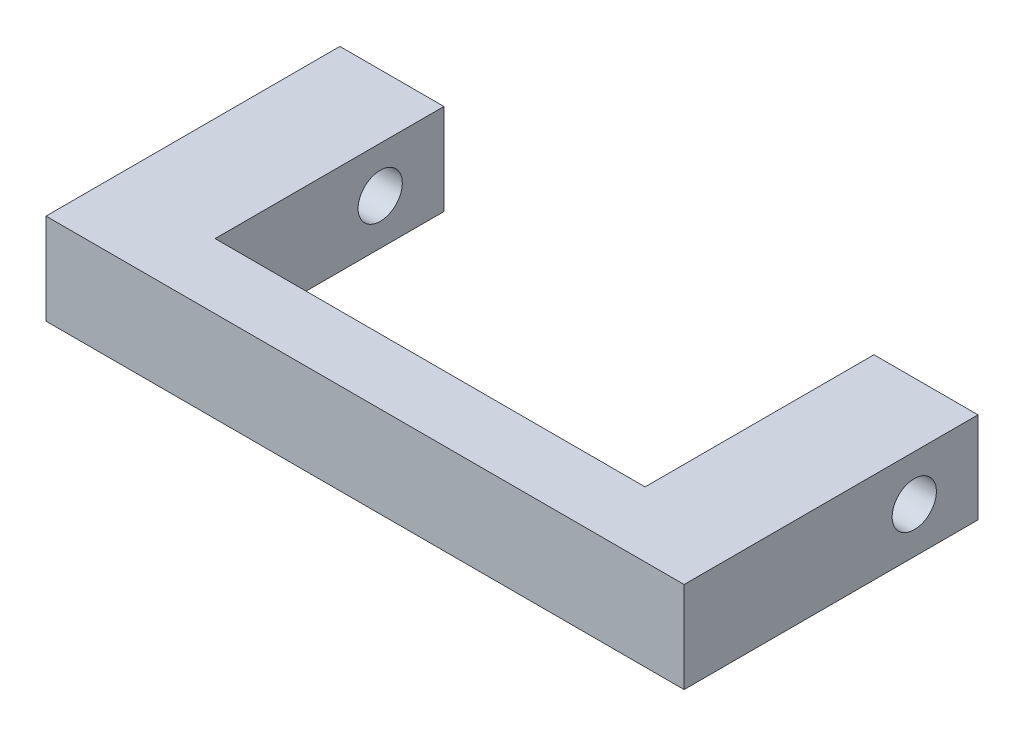
ISO-10303-21;
HEADER;
FILE_DESCRIPTION(('STEP AP214'),'2;1');
FILE_NAME('part.step','',(''),(''),'','','');
FILE_SCHEMA(('AUTOMOTIVE_DESIGN { 1 0 10303 214 1 1 1 1 }'));
ENDSEC;
DATA;
#1=APPLICATION_CONTEXT('core data for automotive mechanical design processes');
#2=APPLICATION_PROTOCOL_DEFINITION('international standard','automotive_design',2000,#1);
#3=PRODUCT_CONTEXT('',#1,'mechanical');
#4=PRODUCT('Part','Part','',(#3));
#5=PRODUCT_RELATED_PRODUCT_CATEGORY('part','',(#4));
#6=PRODUCT_DEFINITION_FORMATION('','',#4);
#7=PRODUCT_DEFINITION_CONTEXT('part definition',#1,'design');
#8=PRODUCT_DEFINITION('design','',#6,#7);
#9=PRODUCT_DEFINITION_SHAPE('','',#8);
#10=(LENGTH_UNIT() NAMED_UNIT(*) SI_UNIT(.MILLI.,.METRE.));
#11=(NAMED_UNIT(*) PLANE_ANGLE_UNIT() SI_UNIT($,.RADIAN.));
#12=(NAMED_UNIT(*) SI_UNIT($,.STERADIAN.) SOLID_ANGLE_UNIT());
#13=UNCERTAINTY_MEASURE_WITH_UNIT(LENGTH_MEASURE(1.E-05),#10,'distance_accuracy_value','');
#14=(GEOMETRIC_REPRESENTATION_CONTEXT(3) GLOBAL_UNCERTAINTY_ASSIGNED_CONTEXT((#13)) GLOBAL_UNIT_ASSIGNED_CONTEXT((#10,
#11,#12)) REPRESENTATION_CONTEXT('',''));
#15=CARTESIAN_POINT('',(0.,0.,0.));
#16=DIRECTION('',(0.,0.,1.));
#17=DIRECTION('',(1.,0.,0.));
#18=AXIS2_PLACEMENT_3D('',#15,#16,#17);
#19=CARTESIAN_POINT('',(-87.25,7.,27.0051780117579));
#20=DIRECTION('',(0.,0.,1.));
#21=DIRECTION('',(1.,0.,0.));
#22=AXIS2_PLACEMENT_3D('',#19,#20,#21);
#23=PLANE('',#22);
#24=DIRECTION('',(-1.,0.,0.));
#25=VECTOR('',#24,1.);
#26=CARTESIAN_POINT('',(-87.25,0.,27.0051780117579));
#27=LINE('',#26,#25);
#28=CARTESIAN_POINT('',(-87.25,0.,27.0051780117579));
#29=VERTEX_POINT('',#28);
#30=CARTESIAN_POINT('',(-95.25,0.,27.0051780117579));
#31=VERTEX_POINT('',#30);
#32=EDGE_CURVE('E141',#29,#31,#27,.T.);
#33=ORIENTED_EDGE('',*,*,#32,.T.);
#34=DIRECTION('',(0.,-1.,0.));
#35=VECTOR('',#34,1.);
#36=CARTESIAN_POINT('',(-95.25,7.,27.0051780117579));
#37=LINE('',#36,#35);
#38=CARTESIAN_POINT('',(-95.25,7.,27.0051780117579));
#39=VERTEX_POINT('',#38);
#40=EDGE_CURVE('E11',#39,#31,#37,.T.);
#41=ORIENTED_EDGE('',*,*,#40,.F.);
#42=DIRECTION('',(-1.,0.,0.));
#43=VECTOR('',#42,1.);
#44=CARTESIAN_POINT('',(-87.25,7.,27.0051780117579));
#45=LINE('',#44,#43);
#46=CARTESIAN_POINT('',(-87.25,7.,27.0051780117579));
#47=VERTEX_POINT('',#46);
#48=EDGE_CURVE('E165',#47,#39,#45,.T.);
#49=ORIENTED_EDGE('',*,*,#48,.F.);
#50=DIRECTION('',(0.,-1.,0.));
#51=VECTOR('',#50,1.);
#52=CARTESIAN_POINT('',(-87.25,7.,27.0051780117579));
#53=LINE('',#52,#51);
#54=EDGE_CURVE('E137',#47,#29,#53,.T.);
#55=ORIENTED_EDGE('',*,*,#54,.T.);
#56=EDGE_LOOP('',(#33,#41,#49,#55));
#57=FACE_BOUND('',#56,.T.);
#58=ADVANCED_FACE('F39',(#57),#23,.F.);
#59=CARTESIAN_POINT('',(-95.25,7.,27.0051780117579));
#60=DIRECTION('',(1.,0.,0.));
#61=DIRECTION('',(0.,0.,-1.));
#62=AXIS2_PLACEMENT_3D('',#59,#60,#61);
#63=PLANE('',#62);
#64=CARTESIAN_POINT('',(-95.25,3.5,31.9051780117579));
#65=DIRECTION('',(1.,0.,0.));
#66=DIRECTION('',(0.,0.,-1.));
#67=AXIS2_PLACEMENT_3D('',#64,#65,#66);
#68=CIRCLE('',#67,1.7);
#69=CARTESIAN_POINT('',(-95.25,3.5,30.2051780117579));
#70=VERTEX_POINT('',#69);
#71=EDGE_CURVE('E146',#70,#70,#68,.T.);
#72=ORIENTED_EDGE('',*,*,#71,.T.);
#73=EDGE_LOOP('',(#72));
#74=FACE_BOUND('',#73,.T.);
#75=DIRECTION('',(0.,0.,1.));
#76=VECTOR('',#75,1.);
#77=CARTESIAN_POINT('',(-95.25,0.,27.0051780117579));
#78=LINE('',#77,#76);
#79=CARTESIAN_POINT('',(-95.25,0.,49.6051780117579));
#80=VERTEX_POINT('',#79);
#81=EDGE_CURVE('E145',#31,#80,#78,.T.);
#82=ORIENTED_EDGE('',*,*,#81,.T.);
#83=DIRECTION('',(0.,-1.,0.));
#84=VECTOR('',#83,1.);
#85=CARTESIAN_POINT('',(-95.25,7.,49.6051780117579));
#86=LINE('',#85,#84);
#87=CARTESIAN_POINT('',(-95.25,7.,49.6051780117579));
#88=VERTEX_POINT('',#87);
#89=EDGE_CURVE('E49',#88,#80,#86,.T.);
#90=ORIENTED_EDGE('',*,*,#89,.F.);
#91=DIRECTION('',(0.,0.,1.));
#92=VECTOR('',#91,1.);
#93=CARTESIAN_POINT('',(-95.25,7.,27.0051780117579));
#94=LINE('',#93,#92);
#95=EDGE_CURVE('E100',#39,#88,#94,.T.);
#96=ORIENTED_EDGE('',*,*,#95,.F.);
#97=ORIENTED_EDGE('',*,*,#40,.T.);
#98=EDGE_LOOP('',(#82,#90,#96,#97));
#99=FACE_BOUND('',#98,.T.);
#100=ADVANCED_FACE('F187',(#74,#99),#63,.F.);
#101=CARTESIAN_POINT('',(-46.181,7.,49.6051780117579));
#102=DIRECTION('',(0.,0.,-1.));
#103=DIRECTION('',(-1.,0.,0.));
#104=AXIS2_PLACEMENT_3D('',#101,#102,#103);
#105=PLANE('',#104);
#106=DIRECTION('',(1.,0.,0.));
#107=VECTOR('',#106,1.);
#108=CARTESIAN_POINT('',(-46.181,0.,49.6051780117579));
#109=LINE('',#108,#107);
#110=CARTESIAN_POINT('',(-46.181,0.,49.6051780117579));
#111=VERTEX_POINT('',#110);
#112=EDGE_CURVE('E150',#80,#111,#109,.T.);
#113=ORIENTED_EDGE('',*,*,#112,.T.);
#114=DIRECTION('',(0.,-1.,0.));
#115=VECTOR('',#114,1.);
#116=CARTESIAN_POINT('',(-46.181,7.,49.6051780117579));
#117=LINE('',#116,#115);
#118=CARTESIAN_POINT('',(-46.181,7.,49.6051780117579));
#119=VERTEX_POINT('',#118);
#120=EDGE_CURVE('E176',#119,#111,#117,.T.);
#121=ORIENTED_EDGE('',*,*,#120,.F.);
#122=DIRECTION('',(1.,0.,0.));
#123=VECTOR('',#122,1.);
#124=CARTESIAN_POINT('',(-95.25,7.,49.6051780117579));
#125=LINE('',#124,#123);
#126=EDGE_CURVE('E186',#88,#119,#125,.T.);
#127=ORIENTED_EDGE('',*,*,#126,.F.);
#128=ORIENTED_EDGE('',*,*,#89,.T.);
#129=EDGE_LOOP('',(#113,#121,#127,#128));
#130=FACE_BOUND('',#129,.T.);
#131=ADVANCED_FACE('F184',(#130),#105,.F.);
#132=CARTESIAN_POINT('',(-46.181,7.,27.0051780117579));
#133=DIRECTION('',(-1.,0.,0.));
#134=DIRECTION('',(0.,0.,1.));
#135=AXIS2_PLACEMENT_3D('',#132,#133,#134);
#136=PLANE('',#135);
#137=CARTESIAN_POINT('',(-46.181,3.5,31.9051780117579));
#138=DIRECTION('',(1.,0.,0.));
#139=DIRECTION('',(0.,0.,-1.));
#140=AXIS2_PLACEMENT_3D('',#137,#138,#139);
#141=CIRCLE('',#140,1.7);
#142=CARTESIAN_POINT('',(-46.181,3.5,30.2051780117579));
#143=VERTEX_POINT('',#142);
#144=EDGE_CURVE('E218',#143,#143,#141,.T.);
#145=ORIENTED_EDGE('',*,*,#144,.F.);
#146=EDGE_LOOP('',(#145));
#147=FACE_BOUND('',#146,.T.);
#148=DIRECTION('',(0.,0.,-1.));
#149=VECTOR('',#148,1.);
#150=CARTESIAN_POINT('',(-46.181,0.,27.0051780117579));
#151=LINE('',#150,#149);
#152=CARTESIAN_POINT('',(-46.181,0.,27.0051780117579));
#153=VERTEX_POINT('',#152);
#154=EDGE_CURVE('E153',#111,#153,#151,.T.);
#155=ORIENTED_EDGE('',*,*,#154,.T.);
#156=DIRECTION('',(0.,-1.,0.));
#157=VECTOR('',#156,1.);
#158=CARTESIAN_POINT('',(-46.181,7.,27.0051780117579));
#159=LINE('',#158,#157);
#160=CARTESIAN_POINT('',(-46.181,7.,27.0051780117579));
#161=VERTEX_POINT('',#160);
#162=EDGE_CURVE('E172',#161,#153,#159,.T.);
#163=ORIENTED_EDGE('',*,*,#162,.F.);
#164=DIRECTION('',(0.,0.,-1.));
#165=VECTOR('',#164,1.);
#166=CARTESIAN_POINT('',(-46.181,7.,27.0051780117579));
#167=LINE('',#166,#165);
#168=EDGE_CURVE('E201',#119,#161,#167,.T.);
#169=ORIENTED_EDGE('',*,*,#168,.F.);
#170=ORIENTED_EDGE('',*,*,#120,.T.);
#171=EDGE_LOOP('',(#155,#163,#169,#170));
#172=FACE_BOUND('',#171,.T.);
#173=ADVANCED_FACE('F196',(#147,#172),#136,.F.);
#174=CARTESIAN_POINT('',(-54.181,7.,27.0051780117579));
#175=DIRECTION('',(0.,0.,1.));
#176=DIRECTION('',(1.,0.,0.));
#177=AXIS2_PLACEMENT_3D('',#174,#175,#176);
#178=PLANE('',#177);
#179=DIRECTION('',(-1.,0.,0.));
#180=VECTOR('',#179,1.);
#181=CARTESIAN_POINT('',(-54.181,0.,27.0051780117579));
#182=LINE('',#181,#180);
#183=CARTESIAN_POINT('',(-54.181,0.,27.0051780117579));
#184=VERTEX_POINT('',#183);
#185=EDGE_CURVE('E156',#153,#184,#182,.T.);
#186=ORIENTED_EDGE('',*,*,#185,.T.);
#187=DIRECTION('',(0.,-1.,0.));
#188=VECTOR('',#187,1.);
#189=CARTESIAN_POINT('',(-54.181,7.,27.0051780117579));
#190=LINE('',#189,#188);
#191=CARTESIAN_POINT('',(-54.181,7.,27.0051780117579));
#192=VERTEX_POINT('',#191);
#193=EDGE_CURVE('E130',#192,#184,#190,.T.);
#194=ORIENTED_EDGE('',*,*,#193,.F.);
#195=DIRECTION('',(-1.,0.,0.));
#196=VECTOR('',#195,1.);
#197=CARTESIAN_POINT('',(-54.181,7.,27.0051780117579));
#198=LINE('',#197,#196);
#199=EDGE_CURVE('E119',#161,#192,#198,.T.);
#200=ORIENTED_EDGE('',*,*,#199,.F.);
#201=ORIENTED_EDGE('',*,*,#162,.T.);
#202=EDGE_LOOP('',(#186,#194,#200,#201));
#203=FACE_BOUND('',#202,.T.);
#204=ADVANCED_FACE('F199',(#203),#178,.F.);
#205=CARTESIAN_POINT('',(-54.181,7.,44.6051780117579));
#206=DIRECTION('',(1.,0.,0.));
#207=DIRECTION('',(0.,0.,-1.));
#208=AXIS2_PLACEMENT_3D('',#205,#206,#207);
#209=PLANE('',#208);
#210=CARTESIAN_POINT('',(-54.181,3.5,31.9051780117579));
#211=DIRECTION('',(1.,0.,0.));
#212=DIRECTION('',(0.,0.,-1.));
#213=AXIS2_PLACEMENT_3D('',#210,#211,#212);
#214=CIRCLE('',#213,1.7);
#215=CARTESIAN_POINT('',(-54.181,3.5,30.2051780117579));
#216=VERTEX_POINT('',#215);
#217=EDGE_CURVE('E214',#216,#216,#214,.T.);
#218=ORIENTED_EDGE('',*,*,#217,.T.);
#219=EDGE_LOOP('',(#218));
#220=FACE_BOUND('',#219,.T.);
#221=DIRECTION('',(0.,0.,1.));
#222=VECTOR('',#221,1.);
#223=CARTESIAN_POINT('',(-54.181,0.,44.6051780117579));
#224=LINE('',#223,#222);
#225=CARTESIAN_POINT('',(-54.181,0.,44.6051780117579));
#226=VERTEX_POINT('',#225);
#227=EDGE_CURVE('E128',#184,#226,#224,.T.);
#228=ORIENTED_EDGE('',*,*,#227,.T.);
#229=DIRECTION('',(0.,-1.,0.));
#230=VECTOR('',#229,1.);
#231=CARTESIAN_POINT('',(-54.181,7.,44.6051780117579));
#232=LINE('',#231,#230);
#233=CARTESIAN_POINT('',(-54.181,7.,44.6051780117579));
#234=VERTEX_POINT('',#233);
#235=EDGE_CURVE('E125',#234,#226,#232,.T.);
#236=ORIENTED_EDGE('',*,*,#235,.F.);
#237=DIRECTION('',(0.,0.,1.));
#238=VECTOR('',#237,1.);
#239=CARTESIAN_POINT('',(-54.181,7.,44.6051780117579));
#240=LINE('',#239,#238);
#241=EDGE_CURVE('E113',#192,#234,#240,.T.);
#242=ORIENTED_EDGE('',*,*,#241,.F.);
#243=ORIENTED_EDGE('',*,*,#193,.T.);
#244=EDGE_LOOP('',(#228,#236,#242,#243));
#245=FACE_BOUND('',#244,.T.);
#246=ADVANCED_FACE('F126',(#220,#245),#209,.F.);
#247=CARTESIAN_POINT('',(-87.25,7.,44.6051780117579));
#248=DIRECTION('',(0.,0.,1.));
#249=DIRECTION('',(1.,0.,0.));
#250=AXIS2_PLACEMENT_3D('',#247,#248,#249);
#251=PLANE('',#250);
#252=DIRECTION('',(-1.,0.,0.));
#253=VECTOR('',#252,1.);
#254=CARTESIAN_POINT('',(-87.25,0.,44.6051780117579));
#255=LINE('',#254,#253);
#256=CARTESIAN_POINT('',(-87.25,0.,44.6051780117579));
#257=VERTEX_POINT('',#256);
#258=EDGE_CURVE('E86',#226,#257,#255,.T.);
#259=ORIENTED_EDGE('',*,*,#258,.T.);
#260=DIRECTION('',(0.,-1.,0.));
#261=VECTOR('',#260,1.);
#262=CARTESIAN_POINT('',(-87.25,7.,44.6051780117579));
#263=LINE('',#262,#261);
#264=CARTESIAN_POINT('',(-87.25,7.,44.6051780117579));
#265=VERTEX_POINT('',#264);
#266=EDGE_CURVE('E131',#265,#257,#263,.T.);
#267=ORIENTED_EDGE('',*,*,#266,.F.);
#268=DIRECTION('',(-1.,0.,0.));
#269=VECTOR('',#268,1.);
#270=CARTESIAN_POINT('',(-87.25,7.,44.6051780117579));
#271=LINE('',#270,#269);
#272=EDGE_CURVE('E117',#234,#265,#271,.T.);
#273=ORIENTED_EDGE('',*,*,#272,.F.);
#274=ORIENTED_EDGE('',*,*,#235,.T.);
#275=EDGE_LOOP('',(#259,#267,#273,#274));
#276=FACE_BOUND('',#275,.T.);
#277=ADVANCED_FACE('F133',(#276),#251,.F.);
#278=CARTESIAN_POINT('',(-87.25,7.,27.0051780117579));
#279=DIRECTION('',(-1.,0.,0.));
#280=DIRECTION('',(0.,0.,1.));
#281=AXIS2_PLACEMENT_3D('',#278,#279,#280);
#282=PLANE('',#281);
#283=CARTESIAN_POINT('',(-87.25,3.5,31.9051780117579));
#284=DIRECTION('',(-1.,0.,0.));
#285=DIRECTION('',(0.,0.,1.));
#286=AXIS2_PLACEMENT_3D('',#283,#284,#285);
#287=CIRCLE('',#286,1.7);
#288=CARTESIAN_POINT('',(-87.25,3.5,33.6051780117579));
#289=VERTEX_POINT('',#288);
#290=EDGE_CURVE('E42',#289,#289,#287,.T.);
#291=ORIENTED_EDGE('',*,*,#290,.T.);
#292=EDGE_LOOP('',(#291));
#293=FACE_BOUND('',#292,.T.);
#294=DIRECTION('',(0.,0.,-1.));
#295=VECTOR('',#294,1.);
#296=CARTESIAN_POINT('',(-87.25,0.,27.0051780117579));
#297=LINE('',#296,#295);
#298=EDGE_CURVE('E92',#257,#29,#297,.T.);
#299=ORIENTED_EDGE('',*,*,#298,.T.);
#300=ORIENTED_EDGE('',*,*,#54,.F.);
#301=DIRECTION('',(0.,0.,-1.));
#302=VECTOR('',#301,1.);
#303=CARTESIAN_POINT('',(-87.25,7.,27.0051780117579));
#304=LINE('',#303,#302);
#305=EDGE_CURVE('E57',#265,#47,#304,.T.);
#306=ORIENTED_EDGE('',*,*,#305,.F.);
#307=ORIENTED_EDGE('',*,*,#266,.T.);
#308=EDGE_LOOP('',(#299,#300,#306,#307));
#309=FACE_BOUND('',#308,.T.);
#310=ADVANCED_FACE('F227',(#293,#309),#282,.F.);
#311=CARTESIAN_POINT('',(0.,7.,0.));
#312=DIRECTION('',(0.,1.,0.));
#313=DIRECTION('',(0.,0.,1.));
#314=AXIS2_PLACEMENT_3D('',#311,#312,#313);
#315=PLANE('',#314);
#316=ORIENTED_EDGE('',*,*,#48,.T.);
#317=ORIENTED_EDGE('',*,*,#95,.T.);
#318=ORIENTED_EDGE('',*,*,#126,.T.);
#319=ORIENTED_EDGE('',*,*,#168,.T.);
#320=ORIENTED_EDGE('',*,*,#199,.T.);
#321=ORIENTED_EDGE('',*,*,#241,.T.);
#322=ORIENTED_EDGE('',*,*,#272,.T.);
#323=ORIENTED_EDGE('',*,*,#305,.T.);
#324=EDGE_LOOP('',(#316,#317,#318,#319,#320,#321,#322,#323));
#325=FACE_BOUND('',#324,.T.);
#326=ADVANCED_FACE('F115',(#325),#315,.T.);
#327=CARTESIAN_POINT('',(0.,0.,0.));
#328=DIRECTION('',(0.,1.,0.));
#329=DIRECTION('',(0.,0.,1.));
#330=AXIS2_PLACEMENT_3D('',#327,#328,#329);
#331=PLANE('',#330);
#332=ORIENTED_EDGE('',*,*,#32,.F.);
#333=ORIENTED_EDGE('',*,*,#298,.F.);
#334=ORIENTED_EDGE('',*,*,#258,.F.);
#335=ORIENTED_EDGE('',*,*,#227,.F.);
#336=ORIENTED_EDGE('',*,*,#185,.F.);
#337=ORIENTED_EDGE('',*,*,#154,.F.);
#338=ORIENTED_EDGE('',*,*,#112,.F.);
#339=ORIENTED_EDGE('',*,*,#81,.F.);
#340=EDGE_LOOP('',(#332,#333,#334,#335,#336,#337,#338,#339));
#341=FACE_BOUND('',#340,.T.);
#342=ADVANCED_FACE('F191',(#341),#331,.F.);
#343=CARTESIAN_POINT('',(-106.181,3.5,31.9051780117579));
#344=DIRECTION('',(1.,0.,0.));
#345=DIRECTION('',(0.,0.,-1.));
#346=AXIS2_PLACEMENT_3D('',#343,#344,#345);
#347=CYLINDRICAL_SURFACE('',#346,1.7);
#348=ORIENTED_EDGE('',*,*,#290,.F.);
#349=EDGE_LOOP('',(#348));
#350=FACE_BOUND('',#349,.T.);
#351=ORIENTED_EDGE('',*,*,#71,.F.);
#352=EDGE_LOOP('',(#351));
#353=FACE_BOUND('',#352,.T.);
#354=ADVANCED_FACE('F229',(#350,#353),#347,.F.);
#355=ORIENTED_EDGE('',*,*,#144,.T.);
#356=EDGE_LOOP('',(#355));
#357=FACE_BOUND('',#356,.T.);
#358=ORIENTED_EDGE('',*,*,#217,.F.);
#359=EDGE_LOOP('',(#358));
#360=FACE_BOUND('',#359,.T.);
#361=ADVANCED_FACE('F232',(#357,#360),#347,.F.);
#362=CLOSED_SHELL('',(#58,#100,#131,#173,#204,#246,#277,#310,#326,#342,#354,#361));
#363=MANIFOLD_SOLID_BREP('B2',#362);
#364=ADVANCED_BREP_SHAPE_REPRESENTATION('',(#18,#363),#14);
#365=SHAPE_DEFINITION_REPRESENTATION(#9,#364);
ENDSEC;
END-ISO-10303-21;
